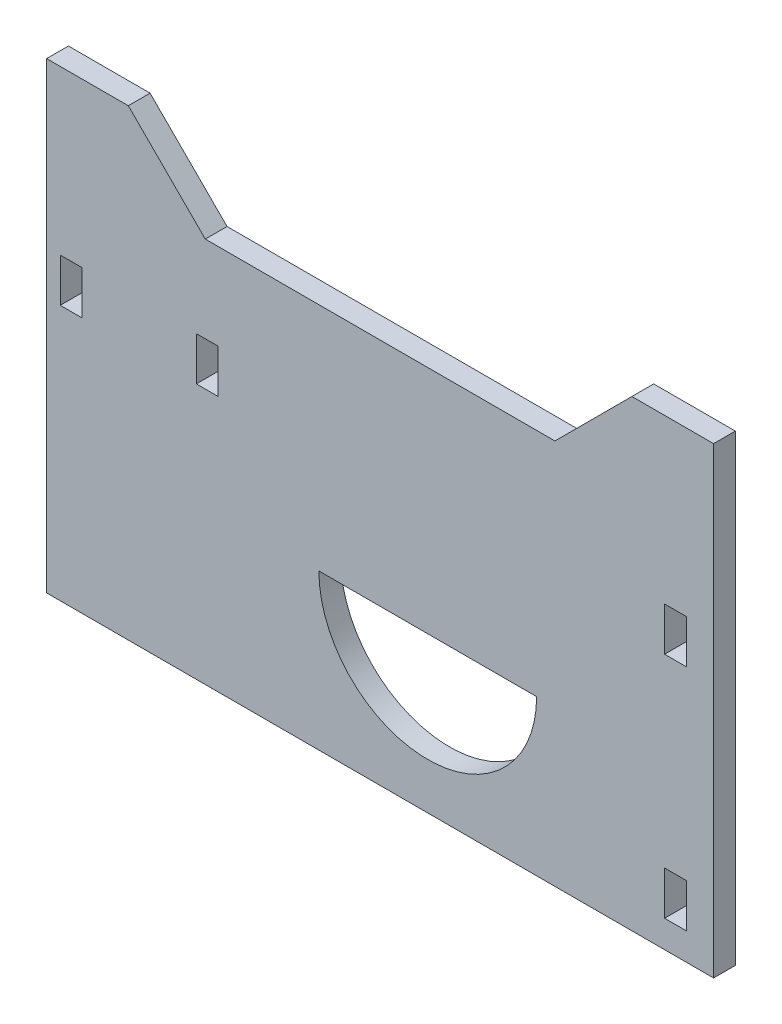
ISO-10303-21;
HEADER;
FILE_DESCRIPTION(('STEP AP214'),'2;1');
FILE_NAME('part.step','',(''),(''),'','','');
FILE_SCHEMA(('AUTOMOTIVE_DESIGN { 1 0 10303 214 1 1 1 1 }'));
ENDSEC;
DATA;
#1=APPLICATION_CONTEXT('core data for automotive mechanical design processes');
#2=APPLICATION_PROTOCOL_DEFINITION('international standard','automotive_design',2000,#1);
#3=PRODUCT_CONTEXT('',#1,'mechanical');
#4=PRODUCT('Part','Part','',(#3));
#5=PRODUCT_RELATED_PRODUCT_CATEGORY('part','',(#4));
#6=PRODUCT_DEFINITION_FORMATION('','',#4);
#7=PRODUCT_DEFINITION_CONTEXT('part definition',#1,'design');
#8=PRODUCT_DEFINITION('design','',#6,#7);
#9=PRODUCT_DEFINITION_SHAPE('','',#8);
#10=(LENGTH_UNIT() NAMED_UNIT(*) SI_UNIT(.MILLI.,.METRE.));
#11=(NAMED_UNIT(*) PLANE_ANGLE_UNIT() SI_UNIT($,.RADIAN.));
#12=(NAMED_UNIT(*) SI_UNIT($,.STERADIAN.) SOLID_ANGLE_UNIT());
#13=UNCERTAINTY_MEASURE_WITH_UNIT(LENGTH_MEASURE(1.E-05),#10,'distance_accuracy_value','');
#14=(GEOMETRIC_REPRESENTATION_CONTEXT(3) GLOBAL_UNCERTAINTY_ASSIGNED_CONTEXT((#13)) GLOBAL_UNIT_ASSIGNED_CONTEXT((#10,
#11,#12)) REPRESENTATION_CONTEXT('',''));
#15=CARTESIAN_POINT('',(0.,0.,0.));
#16=DIRECTION('',(0.,0.,1.));
#17=DIRECTION('',(1.,0.,0.));
#18=AXIS2_PLACEMENT_3D('',#15,#16,#17);
#19=CARTESIAN_POINT('',(0.,0.,4.));
#20=DIRECTION('',(0.,0.,-1.));
#21=DIRECTION('',(-1.,0.,0.));
#22=AXIS2_PLACEMENT_3D('',#19,#20,#21);
#23=PLANE('',#22);
#24=DIRECTION('',(0.,-1.,0.));
#25=VECTOR('',#24,1.);
#26=CARTESIAN_POINT('',(43.4999999999999,25.,4.));
#27=LINE('',#26,#25);
#28=CARTESIAN_POINT('',(43.4999999999999,25.,4.));
#29=VERTEX_POINT('',#28);
#30=CARTESIAN_POINT('',(43.4999999999999,17.,4.));
#31=VERTEX_POINT('',#30);
#32=EDGE_CURVE('E293',#29,#31,#27,.T.);
#33=ORIENTED_EDGE('',*,*,#32,.F.);
#34=DIRECTION('',(-1.,0.,0.));
#35=VECTOR('',#34,1.);
#36=CARTESIAN_POINT('',(43.4999999999999,25.,4.));
#37=LINE('',#36,#35);
#38=CARTESIAN_POINT('',(47.5,25.,4.));
#39=VERTEX_POINT('',#38);
#40=EDGE_CURVE('E301',#39,#29,#37,.T.);
#41=ORIENTED_EDGE('',*,*,#40,.F.);
#42=DIRECTION('',(0.,1.,0.));
#43=VECTOR('',#42,1.);
#44=CARTESIAN_POINT('',(47.5,25.,4.));
#45=LINE('',#44,#43);
#46=CARTESIAN_POINT('',(47.5,17.,4.));
#47=VERTEX_POINT('',#46);
#48=EDGE_CURVE('E298',#47,#39,#45,.T.);
#49=ORIENTED_EDGE('',*,*,#48,.F.);
#50=DIRECTION('',(1.,0.,0.));
#51=VECTOR('',#50,1.);
#52=CARTESIAN_POINT('',(43.4999999999999,17.,4.));
#53=LINE('',#52,#51);
#54=EDGE_CURVE('E295',#31,#47,#53,.T.);
#55=ORIENTED_EDGE('',*,*,#54,.F.);
#56=EDGE_LOOP('',(#33,#41,#49,#55));
#57=FACE_BOUND('',#56,.T.);
#58=DIRECTION('',(0.,-1.,0.));
#59=VECTOR('',#58,1.);
#60=CARTESIAN_POINT('',(-42.5000000000004,25.,4.));
#61=LINE('',#60,#59);
#62=CARTESIAN_POINT('',(-42.5000000000004,25.,4.));
#63=VERTEX_POINT('',#62);
#64=CARTESIAN_POINT('',(-42.5000000000004,17.,4.));
#65=VERTEX_POINT('',#64);
#66=EDGE_CURVE('E355',#63,#65,#61,.T.);
#67=ORIENTED_EDGE('',*,*,#66,.F.);
#68=DIRECTION('',(-1.,0.,0.));
#69=VECTOR('',#68,1.);
#70=CARTESIAN_POINT('',(-42.5000000000004,25.,4.));
#71=LINE('',#70,#69);
#72=CARTESIAN_POINT('',(-38.5000000000002,25.,4.));
#73=VERTEX_POINT('',#72);
#74=EDGE_CURVE('E363',#73,#63,#71,.T.);
#75=ORIENTED_EDGE('',*,*,#74,.F.);
#76=DIRECTION('',(0.,1.,0.));
#77=VECTOR('',#76,1.);
#78=CARTESIAN_POINT('',(-38.5000000000002,25.,4.));
#79=LINE('',#78,#77);
#80=CARTESIAN_POINT('',(-38.5000000000002,17.,4.));
#81=VERTEX_POINT('',#80);
#82=EDGE_CURVE('E360',#81,#73,#79,.T.);
#83=ORIENTED_EDGE('',*,*,#82,.F.);
#84=DIRECTION('',(1.,0.,0.));
#85=VECTOR('',#84,1.);
#86=CARTESIAN_POINT('',(-42.5000000000004,17.,4.));
#87=LINE('',#86,#85);
#88=EDGE_CURVE('E357',#65,#81,#87,.T.);
#89=ORIENTED_EDGE('',*,*,#88,.F.);
#90=EDGE_LOOP('',(#67,#75,#83,#89));
#91=FACE_BOUND('',#90,.T.);
#92=DIRECTION('',(1.,0.,0.));
#93=VECTOR('',#92,1.);
#94=CARTESIAN_POINT('',(-70.0000000000005,-30.,4.));
#95=LINE('',#94,#93);
#96=CARTESIAN_POINT('',(-70.0000000000005,-30.,4.));
#97=VERTEX_POINT('',#96);
#98=CARTESIAN_POINT('',(52.5,-30.,4.));
#99=VERTEX_POINT('',#98);
#100=EDGE_CURVE('E216',#97,#99,#95,.T.);
#101=ORIENTED_EDGE('',*,*,#100,.T.);
#102=DIRECTION('',(0.,1.,0.));
#103=VECTOR('',#102,1.);
#104=CARTESIAN_POINT('',(52.5,30.,4.));
#105=LINE('',#104,#103);
#106=CARTESIAN_POINT('',(52.5,55.,4.));
#107=VERTEX_POINT('',#106);
#108=EDGE_CURVE('E209',#99,#107,#105,.T.);
#109=ORIENTED_EDGE('',*,*,#108,.T.);
#110=DIRECTION('',(-1.,0.,0.));
#111=VECTOR('',#110,1.);
#112=CARTESIAN_POINT('',(37.5,55.,4.));
#113=LINE('',#112,#111);
#114=CARTESIAN_POINT('',(37.5,55.,4.));
#115=VERTEX_POINT('',#114);
#116=EDGE_CURVE('E213',#107,#115,#113,.T.);
#117=ORIENTED_EDGE('',*,*,#116,.T.);
#118=DIRECTION('',(-0.707106781186549,-0.707106781186546,0.));
#119=VECTOR('',#118,1.);
#120=CARTESIAN_POINT('',(23.357864376269,40.857864376269,4.));
#121=LINE('',#120,#119);
#122=CARTESIAN_POINT('',(23.357864376269,40.857864376269,4.));
#123=VERTEX_POINT('',#122);
#124=EDGE_CURVE('E232',#115,#123,#121,.T.);
#125=ORIENTED_EDGE('',*,*,#124,.T.);
#126=DIRECTION('',(-1.,0.,0.));
#127=VECTOR('',#126,1.);
#128=CARTESIAN_POINT('',(23.357864376269,40.857864376269,4.));
#129=LINE('',#128,#127);
#130=CARTESIAN_POINT('',(-40.8578643762696,40.857864376269,4.));
#131=VERTEX_POINT('',#130);
#132=EDGE_CURVE('E235',#123,#131,#129,.T.);
#133=ORIENTED_EDGE('',*,*,#132,.T.);
#134=DIRECTION('',(-0.707106781186546,0.707106781186549,0.));
#135=VECTOR('',#134,1.);
#136=CARTESIAN_POINT('',(-40.8578643762696,40.857864376269,4.));
#137=LINE('',#136,#135);
#138=CARTESIAN_POINT('',(-55.0000000000005,55.,4.));
#139=VERTEX_POINT('',#138);
#140=EDGE_CURVE('E242',#131,#139,#137,.T.);
#141=ORIENTED_EDGE('',*,*,#140,.T.);
#142=DIRECTION('',(-1.,0.,0.));
#143=VECTOR('',#142,1.);
#144=CARTESIAN_POINT('',(-55.0000000000005,55.,4.));
#145=LINE('',#144,#143);
#146=CARTESIAN_POINT('',(-70.0000000000005,55.,4.));
#147=VERTEX_POINT('',#146);
#148=EDGE_CURVE('E244',#139,#147,#145,.T.);
#149=ORIENTED_EDGE('',*,*,#148,.T.);
#150=DIRECTION('',(0.,-1.,0.));
#151=VECTOR('',#150,1.);
#152=CARTESIAN_POINT('',(-70.0000000000005,30.,4.));
#153=LINE('',#152,#151);
#154=EDGE_CURVE('E219',#147,#97,#153,.T.);
#155=ORIENTED_EDGE('',*,*,#154,.T.);
#156=EDGE_LOOP('',(#101,#109,#117,#125,#133,#141,#149,#155));
#157=FACE_BOUND('',#156,.T.);
#158=CARTESIAN_POINT('',(0.,-1.49835732542583,4.));
#159=DIRECTION('',(0.,0.,1.));
#160=DIRECTION('',(1.,0.,0.));
#161=AXIS2_PLACEMENT_3D('',#158,#159,#160);
#162=CIRCLE('',#161,20.);
#163=CARTESIAN_POINT('',(-20.,-1.49835732542588,4.));
#164=VERTEX_POINT('',#163);
#165=CARTESIAN_POINT('',(20.,-1.49835732542583,4.));
#166=VERTEX_POINT('',#165);
#167=EDGE_CURVE('E386',#164,#166,#162,.T.);
#168=ORIENTED_EDGE('',*,*,#167,.F.);
#169=DIRECTION('',(-1.,0.,0.));
#170=VECTOR('',#169,1.);
#171=CARTESIAN_POINT('',(-20.,-1.49835732542588,4.));
#172=LINE('',#171,#170);
#173=EDGE_CURVE('E389',#166,#164,#172,.T.);
#174=ORIENTED_EDGE('',*,*,#173,.F.);
#175=EDGE_LOOP('',(#168,#174));
#176=FACE_BOUND('',#175,.T.);
#177=DIRECTION('',(0.,-1.,0.));
#178=VECTOR('',#177,1.);
#179=CARTESIAN_POINT('',(-67.5000000000005,25.,4.));
#180=LINE('',#179,#178);
#181=CARTESIAN_POINT('',(-67.5000000000005,25.,4.));
#182=VERTEX_POINT('',#181);
#183=CARTESIAN_POINT('',(-67.5000000000005,17.,4.));
#184=VERTEX_POINT('',#183);
#185=EDGE_CURVE('E324',#182,#184,#180,.T.);
#186=ORIENTED_EDGE('',*,*,#185,.F.);
#187=DIRECTION('',(-1.,0.,0.));
#188=VECTOR('',#187,1.);
#189=CARTESIAN_POINT('',(-67.5000000000005,25.,4.));
#190=LINE('',#189,#188);
#191=CARTESIAN_POINT('',(-63.5000000000004,25.,4.));
#192=VERTEX_POINT('',#191);
#193=EDGE_CURVE('E332',#192,#182,#190,.T.);
#194=ORIENTED_EDGE('',*,*,#193,.F.);
#195=DIRECTION('',(0.,1.,0.));
#196=VECTOR('',#195,1.);
#197=CARTESIAN_POINT('',(-63.5000000000004,25.,4.));
#198=LINE('',#197,#196);
#199=CARTESIAN_POINT('',(-63.5000000000004,17.,4.));
#200=VERTEX_POINT('',#199);
#201=EDGE_CURVE('E329',#200,#192,#198,.T.);
#202=ORIENTED_EDGE('',*,*,#201,.F.);
#203=DIRECTION('',(1.,0.,0.));
#204=VECTOR('',#203,1.);
#205=CARTESIAN_POINT('',(-67.5000000000005,17.,4.));
#206=LINE('',#205,#204);
#207=EDGE_CURVE('E326',#184,#200,#206,.T.);
#208=ORIENTED_EDGE('',*,*,#207,.F.);
#209=EDGE_LOOP('',(#186,#194,#202,#208));
#210=FACE_BOUND('',#209,.T.);
#211=DIRECTION('',(0.,1.,0.));
#212=VECTOR('',#211,1.);
#213=CARTESIAN_POINT('',(47.5,-17.,4.));
#214=LINE('',#213,#212);
#215=CARTESIAN_POINT('',(47.5,-25.,4.));
#216=VERTEX_POINT('',#215);
#217=CARTESIAN_POINT('',(47.5,-17.,4.));
#218=VERTEX_POINT('',#217);
#219=EDGE_CURVE('E267',#216,#218,#214,.T.);
#220=ORIENTED_EDGE('',*,*,#219,.F.);
#221=DIRECTION('',(1.,0.,0.));
#222=VECTOR('',#221,1.);
#223=CARTESIAN_POINT('',(47.5,-25.,4.));
#224=LINE('',#223,#222);
#225=CARTESIAN_POINT('',(43.4999999999999,-25.,4.));
#226=VERTEX_POINT('',#225);
#227=EDGE_CURVE('E274',#226,#216,#224,.T.);
#228=ORIENTED_EDGE('',*,*,#227,.F.);
#229=DIRECTION('',(0.,-1.,0.));
#230=VECTOR('',#229,1.);
#231=CARTESIAN_POINT('',(43.4999999999999,-17.,4.));
#232=LINE('',#231,#230);
#233=CARTESIAN_POINT('',(43.4999999999999,-17.,4.));
#234=VERTEX_POINT('',#233);
#235=EDGE_CURVE('E272',#234,#226,#232,.T.);
#236=ORIENTED_EDGE('',*,*,#235,.F.);
#237=DIRECTION('',(-1.,0.,0.));
#238=VECTOR('',#237,1.);
#239=CARTESIAN_POINT('',(47.5,-17.,4.));
#240=LINE('',#239,#238);
#241=EDGE_CURVE('E269',#218,#234,#240,.T.);
#242=ORIENTED_EDGE('',*,*,#241,.F.);
#243=EDGE_LOOP('',(#220,#228,#236,#242));
#244=FACE_BOUND('',#243,.T.);
#245=ADVANCED_FACE('F35',(#57,#91,#157,#176,#210,#244),#23,.F.);
#246=CARTESIAN_POINT('',(0.,0.,0.));
#247=DIRECTION('',(0.,0.,-1.));
#248=DIRECTION('',(-1.,0.,0.));
#249=AXIS2_PLACEMENT_3D('',#246,#247,#248);
#250=PLANE('',#249);
#251=DIRECTION('',(1.,0.,0.));
#252=VECTOR('',#251,1.);
#253=CARTESIAN_POINT('',(-70.0000000000005,-30.,0.));
#254=LINE('',#253,#252);
#255=CARTESIAN_POINT('',(-70.0000000000005,-30.,0.));
#256=VERTEX_POINT('',#255);
#257=CARTESIAN_POINT('',(52.5,-30.,0.));
#258=VERTEX_POINT('',#257);
#259=EDGE_CURVE('E402',#256,#258,#254,.T.);
#260=ORIENTED_EDGE('',*,*,#259,.F.);
#261=DIRECTION('',(0.,-1.,0.));
#262=VECTOR('',#261,1.);
#263=CARTESIAN_POINT('',(-70.0000000000005,30.,0.));
#264=LINE('',#263,#262);
#265=CARTESIAN_POINT('',(-70.0000000000005,55.,0.));
#266=VERTEX_POINT('',#265);
#267=EDGE_CURVE('E403',#266,#256,#264,.T.);
#268=ORIENTED_EDGE('',*,*,#267,.F.);
#269=DIRECTION('',(-1.,0.,0.));
#270=VECTOR('',#269,1.);
#271=CARTESIAN_POINT('',(-55.0000000000005,55.,0.));
#272=LINE('',#271,#270);
#273=CARTESIAN_POINT('',(-55.0000000000005,55.,0.));
#274=VERTEX_POINT('',#273);
#275=EDGE_CURVE('E233',#274,#266,#272,.T.);
#276=ORIENTED_EDGE('',*,*,#275,.F.);
#277=DIRECTION('',(-0.707106781186546,0.707106781186549,0.));
#278=VECTOR('',#277,1.);
#279=CARTESIAN_POINT('',(-40.8578643762696,40.857864376269,0.));
#280=LINE('',#279,#278);
#281=CARTESIAN_POINT('',(-40.8578643762696,40.857864376269,0.));
#282=VERTEX_POINT('',#281);
#283=EDGE_CURVE('E238',#282,#274,#280,.T.);
#284=ORIENTED_EDGE('',*,*,#283,.F.);
#285=DIRECTION('',(-1.,0.,0.));
#286=VECTOR('',#285,1.);
#287=CARTESIAN_POINT('',(23.357864376269,40.857864376269,0.));
#288=LINE('',#287,#286);
#289=CARTESIAN_POINT('',(23.357864376269,40.857864376269,0.));
#290=VERTEX_POINT('',#289);
#291=EDGE_CURVE('E252',#290,#282,#288,.T.);
#292=ORIENTED_EDGE('',*,*,#291,.F.);
#293=DIRECTION('',(-0.707106781186549,-0.707106781186546,0.));
#294=VECTOR('',#293,1.);
#295=CARTESIAN_POINT('',(23.357864376269,40.857864376269,0.));
#296=LINE('',#295,#294);
#297=CARTESIAN_POINT('',(37.5,55.,0.));
#298=VERTEX_POINT('',#297);
#299=EDGE_CURVE('E250',#298,#290,#296,.T.);
#300=ORIENTED_EDGE('',*,*,#299,.F.);
#301=DIRECTION('',(-1.,0.,0.));
#302=VECTOR('',#301,1.);
#303=CARTESIAN_POINT('',(37.5,55.,0.));
#304=LINE('',#303,#302);
#305=CARTESIAN_POINT('',(52.5,55.,0.));
#306=VERTEX_POINT('',#305);
#307=EDGE_CURVE('E248',#306,#298,#304,.T.);
#308=ORIENTED_EDGE('',*,*,#307,.F.);
#309=DIRECTION('',(0.,1.,0.));
#310=VECTOR('',#309,1.);
#311=CARTESIAN_POINT('',(52.5,30.,0.));
#312=LINE('',#311,#310);
#313=EDGE_CURVE('E224',#258,#306,#312,.T.);
#314=ORIENTED_EDGE('',*,*,#313,.F.);
#315=EDGE_LOOP('',(#260,#268,#276,#284,#292,#300,#308,#314));
#316=FACE_BOUND('',#315,.T.);
#317=DIRECTION('',(-1.,0.,0.));
#318=VECTOR('',#317,1.);
#319=CARTESIAN_POINT('',(-20.,-1.49835732542588,0.));
#320=LINE('',#319,#318);
#321=CARTESIAN_POINT('',(20.,-1.49835732542583,0.));
#322=VERTEX_POINT('',#321);
#323=CARTESIAN_POINT('',(-20.,-1.49835732542588,0.));
#324=VERTEX_POINT('',#323);
#325=EDGE_CURVE('E390',#322,#324,#320,.T.);
#326=ORIENTED_EDGE('',*,*,#325,.T.);
#327=CARTESIAN_POINT('',(0.,-1.49835732542583,0.));
#328=DIRECTION('',(0.,0.,1.));
#329=DIRECTION('',(1.,0.,0.));
#330=AXIS2_PLACEMENT_3D('',#327,#328,#329);
#331=CIRCLE('',#330,20.);
#332=EDGE_CURVE('E385',#324,#322,#331,.T.);
#333=ORIENTED_EDGE('',*,*,#332,.T.);
#334=EDGE_LOOP('',(#326,#333));
#335=FACE_BOUND('',#334,.T.);
#336=DIRECTION('',(-1.,0.,0.));
#337=VECTOR('',#336,1.);
#338=CARTESIAN_POINT('',(-42.5000000000004,25.,0.));
#339=LINE('',#338,#337);
#340=CARTESIAN_POINT('',(-38.5000000000002,25.,0.));
#341=VERTEX_POINT('',#340);
#342=CARTESIAN_POINT('',(-42.5000000000004,25.,0.));
#343=VERTEX_POINT('',#342);
#344=EDGE_CURVE('E358',#341,#343,#339,.T.);
#345=ORIENTED_EDGE('',*,*,#344,.T.);
#346=DIRECTION('',(0.,-1.,0.));
#347=VECTOR('',#346,1.);
#348=CARTESIAN_POINT('',(-42.5000000000004,25.,0.));
#349=LINE('',#348,#347);
#350=CARTESIAN_POINT('',(-42.5000000000004,17.,0.));
#351=VERTEX_POINT('',#350);
#352=EDGE_CURVE('E354',#343,#351,#349,.T.);
#353=ORIENTED_EDGE('',*,*,#352,.T.);
#354=DIRECTION('',(1.,0.,0.));
#355=VECTOR('',#354,1.);
#356=CARTESIAN_POINT('',(-42.5000000000004,17.,0.));
#357=LINE('',#356,#355);
#358=CARTESIAN_POINT('',(-38.5000000000002,17.,0.));
#359=VERTEX_POINT('',#358);
#360=EDGE_CURVE('E368',#351,#359,#357,.T.);
#361=ORIENTED_EDGE('',*,*,#360,.T.);
#362=DIRECTION('',(0.,1.,0.));
#363=VECTOR('',#362,1.);
#364=CARTESIAN_POINT('',(-38.5000000000002,25.,0.));
#365=LINE('',#364,#363);
#366=EDGE_CURVE('E371',#359,#341,#365,.T.);
#367=ORIENTED_EDGE('',*,*,#366,.T.);
#368=EDGE_LOOP('',(#345,#353,#361,#367));
#369=FACE_BOUND('',#368,.T.);
#370=DIRECTION('',(-1.,0.,0.));
#371=VECTOR('',#370,1.);
#372=CARTESIAN_POINT('',(-67.5000000000005,25.,0.));
#373=LINE('',#372,#371);
#374=CARTESIAN_POINT('',(-63.5000000000004,25.,0.));
#375=VERTEX_POINT('',#374);
#376=CARTESIAN_POINT('',(-67.5000000000005,25.,0.));
#377=VERTEX_POINT('',#376);
#378=EDGE_CURVE('E327',#375,#377,#373,.T.);
#379=ORIENTED_EDGE('',*,*,#378,.T.);
#380=DIRECTION('',(0.,-1.,0.));
#381=VECTOR('',#380,1.);
#382=CARTESIAN_POINT('',(-67.5000000000005,25.,0.));
#383=LINE('',#382,#381);
#384=CARTESIAN_POINT('',(-67.5000000000005,17.,0.));
#385=VERTEX_POINT('',#384);
#386=EDGE_CURVE('E323',#377,#385,#383,.T.);
#387=ORIENTED_EDGE('',*,*,#386,.T.);
#388=DIRECTION('',(1.,0.,0.));
#389=VECTOR('',#388,1.);
#390=CARTESIAN_POINT('',(-67.5000000000005,17.,0.));
#391=LINE('',#390,#389);
#392=CARTESIAN_POINT('',(-63.5000000000004,17.,0.));
#393=VERTEX_POINT('',#392);
#394=EDGE_CURVE('E337',#385,#393,#391,.T.);
#395=ORIENTED_EDGE('',*,*,#394,.T.);
#396=DIRECTION('',(0.,1.,0.));
#397=VECTOR('',#396,1.);
#398=CARTESIAN_POINT('',(-63.5000000000004,25.,0.));
#399=LINE('',#398,#397);
#400=EDGE_CURVE('E340',#393,#375,#399,.T.);
#401=ORIENTED_EDGE('',*,*,#400,.T.);
#402=EDGE_LOOP('',(#379,#387,#395,#401));
#403=FACE_BOUND('',#402,.T.);
#404=DIRECTION('',(-1.,0.,0.));
#405=VECTOR('',#404,1.);
#406=CARTESIAN_POINT('',(43.4999999999999,25.,0.));
#407=LINE('',#406,#405);
#408=CARTESIAN_POINT('',(47.5,25.,0.));
#409=VERTEX_POINT('',#408);
#410=CARTESIAN_POINT('',(43.4999999999999,25.,0.));
#411=VERTEX_POINT('',#410);
#412=EDGE_CURVE('E296',#409,#411,#407,.T.);
#413=ORIENTED_EDGE('',*,*,#412,.T.);
#414=DIRECTION('',(0.,-1.,0.));
#415=VECTOR('',#414,1.);
#416=CARTESIAN_POINT('',(43.4999999999999,25.,0.));
#417=LINE('',#416,#415);
#418=CARTESIAN_POINT('',(43.4999999999999,17.,0.));
#419=VERTEX_POINT('',#418);
#420=EDGE_CURVE('E292',#411,#419,#417,.T.);
#421=ORIENTED_EDGE('',*,*,#420,.T.);
#422=DIRECTION('',(1.,0.,0.));
#423=VECTOR('',#422,1.);
#424=CARTESIAN_POINT('',(43.4999999999999,17.,0.));
#425=LINE('',#424,#423);
#426=CARTESIAN_POINT('',(47.5,17.,0.));
#427=VERTEX_POINT('',#426);
#428=EDGE_CURVE('E306',#419,#427,#425,.T.);
#429=ORIENTED_EDGE('',*,*,#428,.T.);
#430=DIRECTION('',(0.,1.,0.));
#431=VECTOR('',#430,1.);
#432=CARTESIAN_POINT('',(47.5,25.,0.));
#433=LINE('',#432,#431);
#434=EDGE_CURVE('E309',#427,#409,#433,.T.);
#435=ORIENTED_EDGE('',*,*,#434,.T.);
#436=EDGE_LOOP('',(#413,#421,#429,#435));
#437=FACE_BOUND('',#436,.T.);
#438=DIRECTION('',(1.,0.,0.));
#439=VECTOR('',#438,1.);
#440=CARTESIAN_POINT('',(47.5,-25.,0.));
#441=LINE('',#440,#439);
#442=CARTESIAN_POINT('',(43.4999999999999,-25.,0.));
#443=VERTEX_POINT('',#442);
#444=CARTESIAN_POINT('',(47.5,-25.,0.));
#445=VERTEX_POINT('',#444);
#446=EDGE_CURVE('E270',#443,#445,#441,.T.);
#447=ORIENTED_EDGE('',*,*,#446,.T.);
#448=DIRECTION('',(0.,1.,0.));
#449=VECTOR('',#448,1.);
#450=CARTESIAN_POINT('',(47.5,-17.,0.));
#451=LINE('',#450,#449);
#452=CARTESIAN_POINT('',(47.5,-17.,0.));
#453=VERTEX_POINT('',#452);
#454=EDGE_CURVE('E58',#445,#453,#451,.T.);
#455=ORIENTED_EDGE('',*,*,#454,.T.);
#456=DIRECTION('',(-1.,0.,0.));
#457=VECTOR('',#456,1.);
#458=CARTESIAN_POINT('',(47.5,-17.,0.));
#459=LINE('',#458,#457);
#460=CARTESIAN_POINT('',(43.4999999999999,-17.,0.));
#461=VERTEX_POINT('',#460);
#462=EDGE_CURVE('E278',#453,#461,#459,.T.);
#463=ORIENTED_EDGE('',*,*,#462,.T.);
#464=DIRECTION('',(0.,-1.,0.));
#465=VECTOR('',#464,1.);
#466=CARTESIAN_POINT('',(43.4999999999999,-17.,0.));
#467=LINE('',#466,#465);
#468=EDGE_CURVE('E281',#461,#443,#467,.T.);
#469=ORIENTED_EDGE('',*,*,#468,.T.);
#470=EDGE_LOOP('',(#447,#455,#463,#469));
#471=FACE_BOUND('',#470,.T.);
#472=ADVANCED_FACE('F415',(#316,#335,#369,#403,#437,#471),#250,.T.);
#473=CARTESIAN_POINT('',(-70.0000000000005,-30.,4.));
#474=DIRECTION('',(0.,1.,0.));
#475=DIRECTION('',(-1.,0.,0.));
#476=AXIS2_PLACEMENT_3D('',#473,#474,#475);
#477=PLANE('',#476);
#478=ORIENTED_EDGE('',*,*,#259,.T.);
#479=DIRECTION('',(0.,0.,-1.));
#480=VECTOR('',#479,1.);
#481=CARTESIAN_POINT('',(52.5,-30.,4.));
#482=LINE('',#481,#480);
#483=EDGE_CURVE('E11',#99,#258,#482,.T.);
#484=ORIENTED_EDGE('',*,*,#483,.F.);
#485=ORIENTED_EDGE('',*,*,#100,.F.);
#486=DIRECTION('',(0.,0.,-1.));
#487=VECTOR('',#486,1.);
#488=CARTESIAN_POINT('',(-70.0000000000005,-30.,4.));
#489=LINE('',#488,#487);
#490=EDGE_CURVE('E43',#97,#256,#489,.T.);
#491=ORIENTED_EDGE('',*,*,#490,.T.);
#492=EDGE_LOOP('',(#478,#484,#485,#491));
#493=FACE_BOUND('',#492,.T.);
#494=ADVANCED_FACE('F37',(#493),#477,.F.);
#495=CARTESIAN_POINT('',(52.5,30.,4.));
#496=DIRECTION('',(-1.,0.,0.));
#497=DIRECTION('',(0.,-1.,0.));
#498=AXIS2_PLACEMENT_3D('',#495,#496,#497);
#499=PLANE('',#498);
#500=ORIENTED_EDGE('',*,*,#313,.T.);
#501=DIRECTION('',(0.,0.,-1.));
#502=VECTOR('',#501,1.);
#503=CARTESIAN_POINT('',(52.5,55.,4.));
#504=LINE('',#503,#502);
#505=EDGE_CURVE('E222',#107,#306,#504,.T.);
#506=ORIENTED_EDGE('',*,*,#505,.F.);
#507=ORIENTED_EDGE('',*,*,#108,.F.);
#508=ORIENTED_EDGE('',*,*,#483,.T.);
#509=EDGE_LOOP('',(#500,#506,#507,#508));
#510=FACE_BOUND('',#509,.T.);
#511=ADVANCED_FACE('F223',(#510),#499,.F.);
#512=CARTESIAN_POINT('',(-70.0000000000005,30.,4.));
#513=DIRECTION('',(1.,0.,0.));
#514=DIRECTION('',(0.,0.,-1.));
#515=AXIS2_PLACEMENT_3D('',#512,#513,#514);
#516=PLANE('',#515);
#517=ORIENTED_EDGE('',*,*,#267,.T.);
#518=ORIENTED_EDGE('',*,*,#490,.F.);
#519=ORIENTED_EDGE('',*,*,#154,.F.);
#520=DIRECTION('',(0.,0.,-1.));
#521=VECTOR('',#520,1.);
#522=CARTESIAN_POINT('',(-70.0000000000005,55.,4.));
#523=LINE('',#522,#521);
#524=EDGE_CURVE('E247',#147,#266,#523,.T.);
#525=ORIENTED_EDGE('',*,*,#524,.T.);
#526=EDGE_LOOP('',(#517,#518,#519,#525));
#527=FACE_BOUND('',#526,.T.);
#528=ADVANCED_FACE('F436',(#527),#516,.F.);
#529=CARTESIAN_POINT('',(0.,-1.49835732542583,4.));
#530=DIRECTION('',(0.,0.,-1.));
#531=DIRECTION('',(-1.,0.,0.));
#532=AXIS2_PLACEMENT_3D('',#529,#530,#531);
#533=CYLINDRICAL_SURFACE('',#532,20.);
#534=ORIENTED_EDGE('',*,*,#332,.F.);
#535=DIRECTION('',(0.,0.,-1.));
#536=VECTOR('',#535,1.);
#537=CARTESIAN_POINT('',(-20.,-1.49835732542588,4.));
#538=LINE('',#537,#536);
#539=EDGE_CURVE('E392',#164,#324,#538,.T.);
#540=ORIENTED_EDGE('',*,*,#539,.F.);
#541=ORIENTED_EDGE('',*,*,#167,.T.);
#542=DIRECTION('',(0.,0.,-1.));
#543=VECTOR('',#542,1.);
#544=CARTESIAN_POINT('',(20.,-1.49835732542583,4.));
#545=LINE('',#544,#543);
#546=EDGE_CURVE('E399',#166,#322,#545,.T.);
#547=ORIENTED_EDGE('',*,*,#546,.T.);
#548=EDGE_LOOP('',(#534,#540,#541,#547));
#549=FACE_BOUND('',#548,.T.);
#550=ADVANCED_FACE('F438',(#549),#533,.F.);
#551=CARTESIAN_POINT('',(-20.,-1.49835732542588,4.));
#552=DIRECTION('',(0.,-1.,0.));
#553=DIRECTION('',(1.,0.,0.));
#554=AXIS2_PLACEMENT_3D('',#551,#552,#553);
#555=PLANE('',#554);
#556=ORIENTED_EDGE('',*,*,#325,.F.);
#557=ORIENTED_EDGE('',*,*,#546,.F.);
#558=ORIENTED_EDGE('',*,*,#173,.T.);
#559=ORIENTED_EDGE('',*,*,#539,.T.);
#560=EDGE_LOOP('',(#556,#557,#558,#559));
#561=FACE_BOUND('',#560,.T.);
#562=ADVANCED_FACE('F444',(#561),#555,.T.);
#563=CARTESIAN_POINT('',(-42.5000000000004,25.,4.));
#564=DIRECTION('',(1.,0.,0.));
#565=DIRECTION('',(0.,0.,-1.));
#566=AXIS2_PLACEMENT_3D('',#563,#564,#565);
#567=PLANE('',#566);
#568=ORIENTED_EDGE('',*,*,#352,.F.);
#569=DIRECTION('',(0.,0.,-1.));
#570=VECTOR('',#569,1.);
#571=CARTESIAN_POINT('',(-42.5000000000004,25.,4.));
#572=LINE('',#571,#570);
#573=EDGE_CURVE('E365',#63,#343,#572,.T.);
#574=ORIENTED_EDGE('',*,*,#573,.F.);
#575=ORIENTED_EDGE('',*,*,#66,.T.);
#576=DIRECTION('',(0.,0.,-1.));
#577=VECTOR('',#576,1.);
#578=CARTESIAN_POINT('',(-42.5000000000004,17.,4.));
#579=LINE('',#578,#577);
#580=EDGE_CURVE('E382',#65,#351,#579,.T.);
#581=ORIENTED_EDGE('',*,*,#580,.T.);
#582=EDGE_LOOP('',(#568,#574,#575,#581));
#583=FACE_BOUND('',#582,.T.);
#584=ADVANCED_FACE('F459',(#583),#567,.T.);
#585=CARTESIAN_POINT('',(-42.5000000000004,17.,4.));
#586=DIRECTION('',(0.,1.,0.));
#587=DIRECTION('',(-1.,0.,0.));
#588=AXIS2_PLACEMENT_3D('',#585,#586,#587);
#589=PLANE('',#588);
#590=ORIENTED_EDGE('',*,*,#360,.F.);
#591=ORIENTED_EDGE('',*,*,#580,.F.);
#592=ORIENTED_EDGE('',*,*,#88,.T.);
#593=DIRECTION('',(0.,0.,-1.));
#594=VECTOR('',#593,1.);
#595=CARTESIAN_POINT('',(-38.5000000000002,17.,4.));
#596=LINE('',#595,#594);
#597=EDGE_CURVE('E380',#81,#359,#596,.T.);
#598=ORIENTED_EDGE('',*,*,#597,.T.);
#599=EDGE_LOOP('',(#590,#591,#592,#598));
#600=FACE_BOUND('',#599,.T.);
#601=ADVANCED_FACE('F463',(#600),#589,.T.);
#602=CARTESIAN_POINT('',(-38.5000000000002,25.,4.));
#603=DIRECTION('',(-1.,0.,0.));
#604=DIRECTION('',(0.,0.,1.));
#605=AXIS2_PLACEMENT_3D('',#602,#603,#604);
#606=PLANE('',#605);
#607=ORIENTED_EDGE('',*,*,#366,.F.);
#608=ORIENTED_EDGE('',*,*,#597,.F.);
#609=ORIENTED_EDGE('',*,*,#82,.T.);
#610=DIRECTION('',(0.,0.,-1.));
#611=VECTOR('',#610,1.);
#612=CARTESIAN_POINT('',(-38.5000000000002,25.,4.));
#613=LINE('',#612,#611);
#614=EDGE_CURVE('E378',#73,#341,#613,.T.);
#615=ORIENTED_EDGE('',*,*,#614,.T.);
#616=EDGE_LOOP('',(#607,#608,#609,#615));
#617=FACE_BOUND('',#616,.T.);
#618=ADVANCED_FACE('F467',(#617),#606,.T.);
#619=CARTESIAN_POINT('',(-42.5000000000004,25.,4.));
#620=DIRECTION('',(0.,-1.,0.));
#621=DIRECTION('',(0.,0.,-1.));
#622=AXIS2_PLACEMENT_3D('',#619,#620,#621);
#623=PLANE('',#622);
#624=ORIENTED_EDGE('',*,*,#344,.F.);
#625=ORIENTED_EDGE('',*,*,#614,.F.);
#626=ORIENTED_EDGE('',*,*,#74,.T.);
#627=ORIENTED_EDGE('',*,*,#573,.T.);
#628=EDGE_LOOP('',(#624,#625,#626,#627));
#629=FACE_BOUND('',#628,.T.);
#630=ADVANCED_FACE('F471',(#629),#623,.T.);
#631=CARTESIAN_POINT('',(-67.5000000000005,25.,4.));
#632=DIRECTION('',(1.,0.,0.));
#633=DIRECTION('',(0.,0.,-1.));
#634=AXIS2_PLACEMENT_3D('',#631,#632,#633);
#635=PLANE('',#634);
#636=ORIENTED_EDGE('',*,*,#386,.F.);
#637=DIRECTION('',(0.,0.,-1.));
#638=VECTOR('',#637,1.);
#639=CARTESIAN_POINT('',(-67.5000000000005,25.,4.));
#640=LINE('',#639,#638);
#641=EDGE_CURVE('E334',#182,#377,#640,.T.);
#642=ORIENTED_EDGE('',*,*,#641,.F.);
#643=ORIENTED_EDGE('',*,*,#185,.T.);
#644=DIRECTION('',(0.,0.,-1.));
#645=VECTOR('',#644,1.);
#646=CARTESIAN_POINT('',(-67.5000000000005,17.,4.));
#647=LINE('',#646,#645);
#648=EDGE_CURVE('E351',#184,#385,#647,.T.);
#649=ORIENTED_EDGE('',*,*,#648,.T.);
#650=EDGE_LOOP('',(#636,#642,#643,#649));
#651=FACE_BOUND('',#650,.T.);
#652=ADVANCED_FACE('F475',(#651),#635,.T.);
#653=CARTESIAN_POINT('',(-67.5000000000005,17.,4.));
#654=DIRECTION('',(0.,1.,0.));
#655=DIRECTION('',(-1.,0.,0.));
#656=AXIS2_PLACEMENT_3D('',#653,#654,#655);
#657=PLANE('',#656);
#658=ORIENTED_EDGE('',*,*,#394,.F.);
#659=ORIENTED_EDGE('',*,*,#648,.F.);
#660=ORIENTED_EDGE('',*,*,#207,.T.);
#661=DIRECTION('',(0.,0.,-1.));
#662=VECTOR('',#661,1.);
#663=CARTESIAN_POINT('',(-63.5000000000004,17.,4.));
#664=LINE('',#663,#662);
#665=EDGE_CURVE('E349',#200,#393,#664,.T.);
#666=ORIENTED_EDGE('',*,*,#665,.T.);
#667=EDGE_LOOP('',(#658,#659,#660,#666));
#668=FACE_BOUND('',#667,.T.);
#669=ADVANCED_FACE('F479',(#668),#657,.T.);
#670=CARTESIAN_POINT('',(-63.5000000000004,25.,4.));
#671=DIRECTION('',(-1.,0.,0.));
#672=DIRECTION('',(0.,0.,1.));
#673=AXIS2_PLACEMENT_3D('',#670,#671,#672);
#674=PLANE('',#673);
#675=ORIENTED_EDGE('',*,*,#400,.F.);
#676=ORIENTED_EDGE('',*,*,#665,.F.);
#677=ORIENTED_EDGE('',*,*,#201,.T.);
#678=DIRECTION('',(0.,0.,-1.));
#679=VECTOR('',#678,1.);
#680=CARTESIAN_POINT('',(-63.5000000000004,25.,4.));
#681=LINE('',#680,#679);
#682=EDGE_CURVE('E347',#192,#375,#681,.T.);
#683=ORIENTED_EDGE('',*,*,#682,.T.);
#684=EDGE_LOOP('',(#675,#676,#677,#683));
#685=FACE_BOUND('',#684,.T.);
#686=ADVANCED_FACE('F483',(#685),#674,.T.);
#687=CARTESIAN_POINT('',(-67.5000000000005,25.,4.));
#688=DIRECTION('',(0.,-1.,0.));
#689=DIRECTION('',(1.,0.,0.));
#690=AXIS2_PLACEMENT_3D('',#687,#688,#689);
#691=PLANE('',#690);
#692=ORIENTED_EDGE('',*,*,#378,.F.);
#693=ORIENTED_EDGE('',*,*,#682,.F.);
#694=ORIENTED_EDGE('',*,*,#193,.T.);
#695=ORIENTED_EDGE('',*,*,#641,.T.);
#696=EDGE_LOOP('',(#692,#693,#694,#695));
#697=FACE_BOUND('',#696,.T.);
#698=ADVANCED_FACE('F487',(#697),#691,.T.);
#699=CARTESIAN_POINT('',(43.4999999999999,25.,4.));
#700=DIRECTION('',(1.,0.,0.));
#701=DIRECTION('',(0.,0.,-1.));
#702=AXIS2_PLACEMENT_3D('',#699,#700,#701);
#703=PLANE('',#702);
#704=ORIENTED_EDGE('',*,*,#420,.F.);
#705=DIRECTION('',(0.,0.,-1.));
#706=VECTOR('',#705,1.);
#707=CARTESIAN_POINT('',(43.4999999999999,25.,4.));
#708=LINE('',#707,#706);
#709=EDGE_CURVE('E303',#29,#411,#708,.T.);
#710=ORIENTED_EDGE('',*,*,#709,.F.);
#711=ORIENTED_EDGE('',*,*,#32,.T.);
#712=DIRECTION('',(0.,0.,-1.));
#713=VECTOR('',#712,1.);
#714=CARTESIAN_POINT('',(43.4999999999999,17.,4.));
#715=LINE('',#714,#713);
#716=EDGE_CURVE('E320',#31,#419,#715,.T.);
#717=ORIENTED_EDGE('',*,*,#716,.T.);
#718=EDGE_LOOP('',(#704,#710,#711,#717));
#719=FACE_BOUND('',#718,.T.);
#720=ADVANCED_FACE('F491',(#719),#703,.T.);
#721=CARTESIAN_POINT('',(43.4999999999999,17.,4.));
#722=DIRECTION('',(0.,1.,0.));
#723=DIRECTION('',(-1.,0.,0.));
#724=AXIS2_PLACEMENT_3D('',#721,#722,#723);
#725=PLANE('',#724);
#726=ORIENTED_EDGE('',*,*,#428,.F.);
#727=ORIENTED_EDGE('',*,*,#716,.F.);
#728=ORIENTED_EDGE('',*,*,#54,.T.);
#729=DIRECTION('',(0.,0.,-1.));
#730=VECTOR('',#729,1.);
#731=CARTESIAN_POINT('',(47.5,17.,4.));
#732=LINE('',#731,#730);
#733=EDGE_CURVE('E318',#47,#427,#732,.T.);
#734=ORIENTED_EDGE('',*,*,#733,.T.);
#735=EDGE_LOOP('',(#726,#727,#728,#734));
#736=FACE_BOUND('',#735,.T.);
#737=ADVANCED_FACE('F495',(#736),#725,.T.);
#738=CARTESIAN_POINT('',(47.5,25.,4.));
#739=DIRECTION('',(-1.,0.,0.));
#740=DIRECTION('',(0.,0.,1.));
#741=AXIS2_PLACEMENT_3D('',#738,#739,#740);
#742=PLANE('',#741);
#743=ORIENTED_EDGE('',*,*,#434,.F.);
#744=ORIENTED_EDGE('',*,*,#733,.F.);
#745=ORIENTED_EDGE('',*,*,#48,.T.);
#746=DIRECTION('',(0.,0.,-1.));
#747=VECTOR('',#746,1.);
#748=CARTESIAN_POINT('',(47.5,25.,4.));
#749=LINE('',#748,#747);
#750=EDGE_CURVE('E316',#39,#409,#749,.T.);
#751=ORIENTED_EDGE('',*,*,#750,.T.);
#752=EDGE_LOOP('',(#743,#744,#745,#751));
#753=FACE_BOUND('',#752,.T.);
#754=ADVANCED_FACE('F499',(#753),#742,.T.);
#755=CARTESIAN_POINT('',(43.4999999999999,25.,4.));
#756=DIRECTION('',(0.,-1.,0.));
#757=DIRECTION('',(1.,0.,0.));
#758=AXIS2_PLACEMENT_3D('',#755,#756,#757);
#759=PLANE('',#758);
#760=ORIENTED_EDGE('',*,*,#412,.F.);
#761=ORIENTED_EDGE('',*,*,#750,.F.);
#762=ORIENTED_EDGE('',*,*,#40,.T.);
#763=ORIENTED_EDGE('',*,*,#709,.T.);
#764=EDGE_LOOP('',(#760,#761,#762,#763));
#765=FACE_BOUND('',#764,.T.);
#766=ADVANCED_FACE('F503',(#765),#759,.T.);
#767=CARTESIAN_POINT('',(47.5,-17.,4.));
#768=DIRECTION('',(-1.,0.,0.));
#769=DIRECTION('',(0.,0.,1.));
#770=AXIS2_PLACEMENT_3D('',#767,#768,#769);
#771=PLANE('',#770);
#772=ORIENTED_EDGE('',*,*,#454,.F.);
#773=DIRECTION('',(0.,0.,-1.));
#774=VECTOR('',#773,1.);
#775=CARTESIAN_POINT('',(47.5,-25.,4.));
#776=LINE('',#775,#774);
#777=EDGE_CURVE('E276',#216,#445,#776,.T.);
#778=ORIENTED_EDGE('',*,*,#777,.F.);
#779=ORIENTED_EDGE('',*,*,#219,.T.);
#780=DIRECTION('',(0.,0.,-1.));
#781=VECTOR('',#780,1.);
#782=CARTESIAN_POINT('',(47.5,-17.,4.));
#783=LINE('',#782,#781);
#784=EDGE_CURVE('E290',#218,#453,#783,.T.);
#785=ORIENTED_EDGE('',*,*,#784,.T.);
#786=EDGE_LOOP('',(#772,#778,#779,#785));
#787=FACE_BOUND('',#786,.T.);
#788=ADVANCED_FACE('F507',(#787),#771,.T.);
#789=CARTESIAN_POINT('',(47.5,-17.,4.));
#790=DIRECTION('',(0.,-1.,0.));
#791=DIRECTION('',(1.,0.,0.));
#792=AXIS2_PLACEMENT_3D('',#789,#790,#791);
#793=PLANE('',#792);
#794=ORIENTED_EDGE('',*,*,#462,.F.);
#795=ORIENTED_EDGE('',*,*,#784,.F.);
#796=ORIENTED_EDGE('',*,*,#241,.T.);
#797=DIRECTION('',(0.,0.,-1.));
#798=VECTOR('',#797,1.);
#799=CARTESIAN_POINT('',(43.4999999999999,-17.,4.));
#800=LINE('',#799,#798);
#801=EDGE_CURVE('E288',#234,#461,#800,.T.);
#802=ORIENTED_EDGE('',*,*,#801,.T.);
#803=EDGE_LOOP('',(#794,#795,#796,#802));
#804=FACE_BOUND('',#803,.T.);
#805=ADVANCED_FACE('F511',(#804),#793,.T.);
#806=CARTESIAN_POINT('',(43.4999999999999,-17.,4.));
#807=DIRECTION('',(1.,0.,0.));
#808=DIRECTION('',(0.,0.,-1.));
#809=AXIS2_PLACEMENT_3D('',#806,#807,#808);
#810=PLANE('',#809);
#811=ORIENTED_EDGE('',*,*,#468,.F.);
#812=ORIENTED_EDGE('',*,*,#801,.F.);
#813=ORIENTED_EDGE('',*,*,#235,.T.);
#814=DIRECTION('',(0.,0.,-1.));
#815=VECTOR('',#814,1.);
#816=CARTESIAN_POINT('',(43.4999999999999,-25.,4.));
#817=LINE('',#816,#815);
#818=EDGE_CURVE('E50',#226,#443,#817,.T.);
#819=ORIENTED_EDGE('',*,*,#818,.T.);
#820=EDGE_LOOP('',(#811,#812,#813,#819));
#821=FACE_BOUND('',#820,.T.);
#822=ADVANCED_FACE('F514',(#821),#810,.T.);
#823=CARTESIAN_POINT('',(47.5,-25.,4.));
#824=DIRECTION('',(0.,1.,0.));
#825=DIRECTION('',(0.,0.,1.));
#826=AXIS2_PLACEMENT_3D('',#823,#824,#825);
#827=PLANE('',#826);
#828=ORIENTED_EDGE('',*,*,#446,.F.);
#829=ORIENTED_EDGE('',*,*,#818,.F.);
#830=ORIENTED_EDGE('',*,*,#227,.T.);
#831=ORIENTED_EDGE('',*,*,#777,.T.);
#832=EDGE_LOOP('',(#828,#829,#830,#831));
#833=FACE_BOUND('',#832,.T.);
#834=ADVANCED_FACE('F518',(#833),#827,.T.);
#835=CARTESIAN_POINT('',(37.5,55.,4.));
#836=DIRECTION('',(0.,-1.,0.));
#837=DIRECTION('',(1.,0.,0.));
#838=AXIS2_PLACEMENT_3D('',#835,#836,#837);
#839=PLANE('',#838);
#840=ORIENTED_EDGE('',*,*,#307,.T.);
#841=DIRECTION('',(0.,0.,-1.));
#842=VECTOR('',#841,1.);
#843=CARTESIAN_POINT('',(37.5,55.,4.));
#844=LINE('',#843,#842);
#845=EDGE_CURVE('E227',#115,#298,#844,.T.);
#846=ORIENTED_EDGE('',*,*,#845,.F.);
#847=ORIENTED_EDGE('',*,*,#116,.F.);
#848=ORIENTED_EDGE('',*,*,#505,.T.);
#849=EDGE_LOOP('',(#840,#846,#847,#848));
#850=FACE_BOUND('',#849,.T.);
#851=ADVANCED_FACE('F229',(#850),#839,.F.);
#852=CARTESIAN_POINT('',(23.357864376269,40.857864376269,4.));
#853=DIRECTION('',(0.707106781186546,-0.707106781186549,0.));
#854=DIRECTION('',(0.707106781186549,0.707106781186546,0.));
#855=AXIS2_PLACEMENT_3D('',#852,#853,#854);
#856=PLANE('',#855);
#857=ORIENTED_EDGE('',*,*,#299,.T.);
#858=DIRECTION('',(0.,0.,-1.));
#859=VECTOR('',#858,1.);
#860=CARTESIAN_POINT('',(23.357864376269,40.857864376269,4.));
#861=LINE('',#860,#859);
#862=EDGE_CURVE('E263',#123,#290,#861,.T.);
#863=ORIENTED_EDGE('',*,*,#862,.F.);
#864=ORIENTED_EDGE('',*,*,#124,.F.);
#865=ORIENTED_EDGE('',*,*,#845,.T.);
#866=EDGE_LOOP('',(#857,#863,#864,#865));
#867=FACE_BOUND('',#866,.T.);
#868=ADVANCED_FACE('F421',(#867),#856,.F.);
#869=CARTESIAN_POINT('',(23.357864376269,40.857864376269,4.));
#870=DIRECTION('',(0.,-1.,0.));
#871=DIRECTION('',(1.,0.,0.));
#872=AXIS2_PLACEMENT_3D('',#869,#870,#871);
#873=PLANE('',#872);
#874=ORIENTED_EDGE('',*,*,#291,.T.);
#875=DIRECTION('',(0.,0.,-1.));
#876=VECTOR('',#875,1.);
#877=CARTESIAN_POINT('',(-40.8578643762696,40.857864376269,4.));
#878=LINE('',#877,#876);
#879=EDGE_CURVE('E260',#131,#282,#878,.T.);
#880=ORIENTED_EDGE('',*,*,#879,.F.);
#881=ORIENTED_EDGE('',*,*,#132,.F.);
#882=ORIENTED_EDGE('',*,*,#862,.T.);
#883=EDGE_LOOP('',(#874,#880,#881,#882));
#884=FACE_BOUND('',#883,.T.);
#885=ADVANCED_FACE('F428',(#884),#873,.F.);
#886=CARTESIAN_POINT('',(-40.8578643762696,40.857864376269,4.));
#887=DIRECTION('',(-0.707106781186549,-0.707106781186546,0.));
#888=DIRECTION('',(0.707106781186546,-0.707106781186549,0.));
#889=AXIS2_PLACEMENT_3D('',#886,#887,#888);
#890=PLANE('',#889);
#891=ORIENTED_EDGE('',*,*,#283,.T.);
#892=DIRECTION('',(0.,0.,-1.));
#893=VECTOR('',#892,1.);
#894=CARTESIAN_POINT('',(-55.0000000000005,55.,4.));
#895=LINE('',#894,#893);
#896=EDGE_CURVE('E257',#139,#274,#895,.T.);
#897=ORIENTED_EDGE('',*,*,#896,.F.);
#898=ORIENTED_EDGE('',*,*,#140,.F.);
#899=ORIENTED_EDGE('',*,*,#879,.T.);
#900=EDGE_LOOP('',(#891,#897,#898,#899));
#901=FACE_BOUND('',#900,.T.);
#902=ADVANCED_FACE('F431',(#901),#890,.F.);
#903=CARTESIAN_POINT('',(-55.0000000000005,55.,4.));
#904=DIRECTION('',(0.,-1.,0.));
#905=DIRECTION('',(1.,0.,0.));
#906=AXIS2_PLACEMENT_3D('',#903,#904,#905);
#907=PLANE('',#906);
#908=ORIENTED_EDGE('',*,*,#275,.T.);
#909=ORIENTED_EDGE('',*,*,#524,.F.);
#910=ORIENTED_EDGE('',*,*,#148,.F.);
#911=ORIENTED_EDGE('',*,*,#896,.T.);
#912=EDGE_LOOP('',(#908,#909,#910,#911));
#913=FACE_BOUND('',#912,.T.);
#914=ADVANCED_FACE('F435',(#913),#907,.F.);
#915=CLOSED_SHELL('',(#245,#472,#494,#511,#528,#550,#562,#584,#601,#618,#630,#652,#669,#686,
#698,#720,#737,#754,#766,#788,#805,#822,#834,#851,#868,#885,#902,#914));
#916=MANIFOLD_SOLID_BREP('B2',#915);
#917=ADVANCED_BREP_SHAPE_REPRESENTATION('',(#18,#916),#14);
#918=SHAPE_DEFINITION_REPRESENTATION(#9,#917);
ENDSEC;
END-ISO-10303-21;
